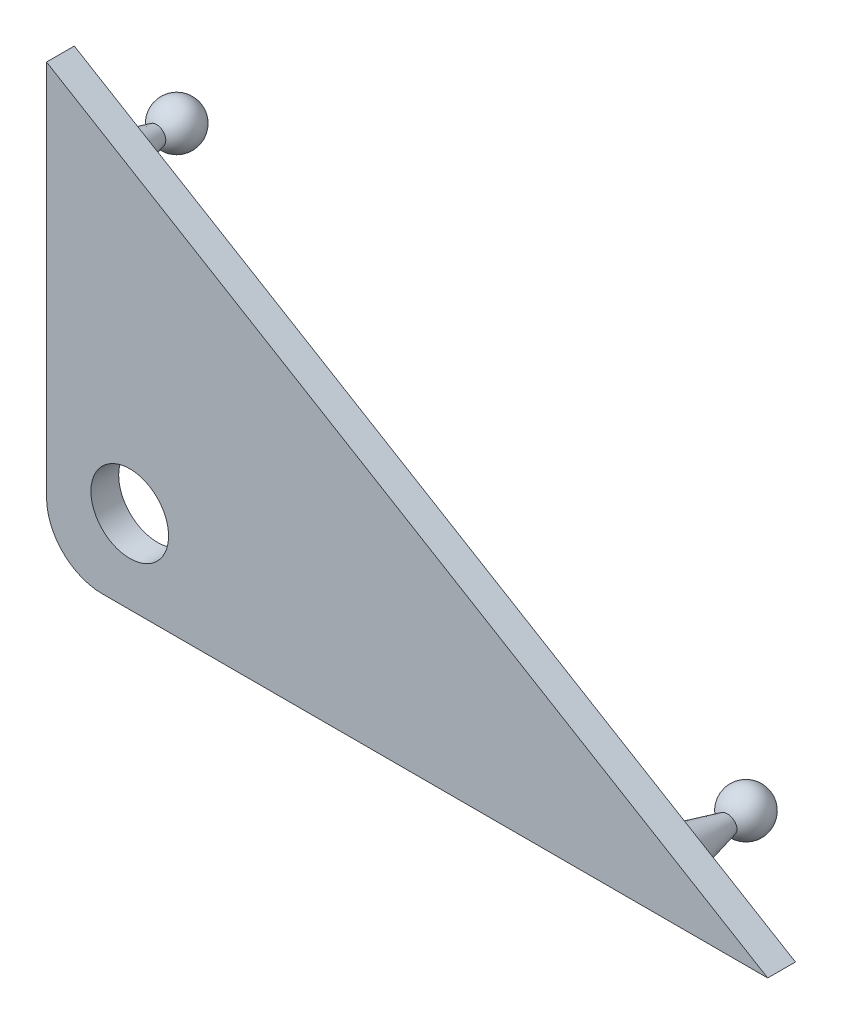
ISO-10303-21;
HEADER;
FILE_DESCRIPTION(('STEP AP214'),'2;1');
FILE_NAME('part.step','',(''),(''),'','','');
FILE_SCHEMA(('AUTOMOTIVE_DESIGN { 1 0 10303 214 1 1 1 1 }'));
ENDSEC;
DATA;
#1=APPLICATION_CONTEXT('core data for automotive mechanical design processes');
#2=APPLICATION_PROTOCOL_DEFINITION('international standard','automotive_design',2000,#1);
#3=PRODUCT_CONTEXT('',#1,'mechanical');
#4=PRODUCT('Part','Part','',(#3));
#5=PRODUCT_RELATED_PRODUCT_CATEGORY('part','',(#4));
#6=PRODUCT_DEFINITION_FORMATION('','',#4);
#7=PRODUCT_DEFINITION_CONTEXT('part definition',#1,'design');
#8=PRODUCT_DEFINITION('design','',#6,#7);
#9=PRODUCT_DEFINITION_SHAPE('','',#8);
#10=(LENGTH_UNIT() NAMED_UNIT(*) SI_UNIT(.MILLI.,.METRE.));
#11=(NAMED_UNIT(*) PLANE_ANGLE_UNIT() SI_UNIT($,.RADIAN.));
#12=(NAMED_UNIT(*) SI_UNIT($,.STERADIAN.) SOLID_ANGLE_UNIT());
#13=UNCERTAINTY_MEASURE_WITH_UNIT(LENGTH_MEASURE(1.E-05),#10,'distance_accuracy_value','');
#14=(GEOMETRIC_REPRESENTATION_CONTEXT(3) GLOBAL_UNCERTAINTY_ASSIGNED_CONTEXT((#13)) GLOBAL_UNIT_ASSIGNED_CONTEXT((#10,
#11,#12)) REPRESENTATION_CONTEXT('',''));
#15=CARTESIAN_POINT('',(0.,0.,0.));
#16=DIRECTION('',(0.,0.,1.));
#17=DIRECTION('',(1.,0.,0.));
#18=AXIS2_PLACEMENT_3D('',#15,#16,#17);
#19=CARTESIAN_POINT('',(0.,0.,0.));
#20=DIRECTION('',(0.,0.,-1.));
#21=DIRECTION('',(-1.,0.,0.));
#22=AXIS2_PLACEMENT_3D('',#19,#20,#21);
#23=PLANE('',#22);
#24=CARTESIAN_POINT('',(5.46398521278585,62.1376068087983,0.));
#25=DIRECTION('',(0.,0.,-1.));
#26=DIRECTION('',(-1.,0.,0.));
#27=AXIS2_PLACEMENT_3D('',#24,#25,#26);
#28=CIRCLE('',#27,4.);
#29=CARTESIAN_POINT('',(1.46398521278585,62.1376068087983,0.));
#30=VERTEX_POINT('',#29);
#31=EDGE_CURVE('E111',#30,#30,#28,.T.);
#32=ORIENTED_EDGE('',*,*,#31,.F.);
#33=EDGE_LOOP('',(#32));
#34=FACE_BOUND('',#33,.T.);
#35=CARTESIAN_POINT('',(15.,15.,0.));
#36=DIRECTION('',(0.,0.,-1.));
#37=DIRECTION('',(-1.,0.,0.));
#38=AXIS2_PLACEMENT_3D('',#35,#36,#37);
#39=CIRCLE('',#38,7.);
#40=CARTESIAN_POINT('',(8.,15.,0.));
#41=VERTEX_POINT('',#40);
#42=EDGE_CURVE('E116',#41,#41,#39,.T.);
#43=ORIENTED_EDGE('',*,*,#42,.F.);
#44=EDGE_LOOP('',(#43));
#45=FACE_BOUND('',#44,.T.);
#46=DIRECTION('',(1.,0.,0.));
#47=VECTOR('',#46,1.);
#48=CARTESIAN_POINT('',(130.,0.,0.));
#49=LINE('',#48,#47);
#50=CARTESIAN_POINT('',(9.99999999999999,0.,0.));
#51=VERTEX_POINT('',#50);
#52=CARTESIAN_POINT('',(130.,0.,0.));
#53=VERTEX_POINT('',#52);
#54=EDGE_CURVE('E100',#51,#53,#49,.T.);
#55=ORIENTED_EDGE('',*,*,#54,.F.);
#56=CARTESIAN_POINT('',(9.99999999999999,10.,0.));
#57=DIRECTION('',(0.,0.,-1.));
#58=DIRECTION('',(-1.,0.,0.));
#59=AXIS2_PLACEMENT_3D('',#56,#57,#58);
#60=CIRCLE('',#59,10.);
#61=CARTESIAN_POINT('',(0.,10.,0.));
#62=VERTEX_POINT('',#61);
#63=EDGE_CURVE('E61',#51,#62,#60,.T.);
#64=ORIENTED_EDGE('',*,*,#63,.T.);
#65=DIRECTION('',(0.,-1.,0.));
#66=VECTOR('',#65,1.);
#67=CARTESIAN_POINT('',(0.,0.,0.));
#68=LINE('',#67,#66);
#69=CARTESIAN_POINT('',(0.,78.,0.));
#70=VERTEX_POINT('',#69);
#71=EDGE_CURVE('E89',#70,#62,#68,.T.);
#72=ORIENTED_EDGE('',*,*,#71,.F.);
#73=DIRECTION('',(-0.857492925712544,0.514495755427526,0.));
#74=VECTOR('',#73,1.);
#75=CARTESIAN_POINT('',(0.,78.,0.));
#76=LINE('',#75,#74);
#77=EDGE_CURVE('E131',#53,#70,#76,.T.);
#78=ORIENTED_EDGE('',*,*,#77,.F.);
#79=EDGE_LOOP('',(#55,#64,#72,#78));
#80=FACE_BOUND('',#79,.T.);
#81=CARTESIAN_POINT('',(108.338096210309,6.,0.));
#82=DIRECTION('',(0.,0.,-1.));
#83=DIRECTION('',(-1.,0.,0.));
#84=AXIS2_PLACEMENT_3D('',#81,#82,#83);
#85=CIRCLE('',#84,4.00000000000001);
#86=CARTESIAN_POINT('',(104.338096210309,6.,0.));
#87=VERTEX_POINT('',#86);
#88=EDGE_CURVE('E112',#87,#87,#85,.T.);
#89=ORIENTED_EDGE('',*,*,#88,.F.);
#90=EDGE_LOOP('',(#89));
#91=FACE_BOUND('',#90,.T.);
#92=ADVANCED_FACE('F33',(#34,#45,#80,#91),#23,.T.);
#93=CARTESIAN_POINT('',(130.,0.,5.));
#94=DIRECTION('',(0.,1.,0.));
#95=DIRECTION('',(-1.,0.,0.));
#96=AXIS2_PLACEMENT_3D('',#93,#94,#95);
#97=PLANE('',#96);
#98=DIRECTION('',(1.,0.,0.));
#99=VECTOR('',#98,1.);
#100=CARTESIAN_POINT('',(130.,0.,5.));
#101=LINE('',#100,#99);
#102=CARTESIAN_POINT('',(9.99999999999999,0.,5.));
#103=VERTEX_POINT('',#102);
#104=CARTESIAN_POINT('',(130.,0.,5.));
#105=VERTEX_POINT('',#104);
#106=EDGE_CURVE('E79',#103,#105,#101,.T.);
#107=ORIENTED_EDGE('',*,*,#106,.F.);
#108=DIRECTION('',(0.,0.,-1.));
#109=VECTOR('',#108,1.);
#110=CARTESIAN_POINT('',(9.99999999999999,0.,5.));
#111=LINE('',#110,#109);
#112=EDGE_CURVE('E102',#103,#51,#111,.T.);
#113=ORIENTED_EDGE('',*,*,#112,.T.);
#114=ORIENTED_EDGE('',*,*,#54,.T.);
#115=DIRECTION('',(0.,0.,-1.));
#116=VECTOR('',#115,1.);
#117=CARTESIAN_POINT('',(130.,0.,5.));
#118=LINE('',#117,#116);
#119=EDGE_CURVE('E94',#105,#53,#118,.T.);
#120=ORIENTED_EDGE('',*,*,#119,.F.);
#121=EDGE_LOOP('',(#107,#113,#114,#120));
#122=FACE_BOUND('',#121,.T.);
#123=ADVANCED_FACE('F99',(#122),#97,.F.);
#124=CARTESIAN_POINT('',(0.,78.,5.));
#125=DIRECTION('',(-0.514495755427526,-0.857492925712544,0.));
#126=DIRECTION('',(0.857492925712544,-0.514495755427526,0.));
#127=AXIS2_PLACEMENT_3D('',#124,#125,#126);
#128=PLANE('',#127);
#129=ORIENTED_EDGE('',*,*,#77,.T.);
#130=DIRECTION('',(0.,0.,-1.));
#131=VECTOR('',#130,1.);
#132=CARTESIAN_POINT('',(0.,78.,5.));
#133=LINE('',#132,#131);
#134=CARTESIAN_POINT('',(0.,78.,5.));
#135=VERTEX_POINT('',#134);
#136=EDGE_CURVE('E96',#135,#70,#133,.T.);
#137=ORIENTED_EDGE('',*,*,#136,.F.);
#138=DIRECTION('',(-0.857492925712544,0.514495755427526,0.));
#139=VECTOR('',#138,1.);
#140=CARTESIAN_POINT('',(0.,78.,5.));
#141=LINE('',#140,#139);
#142=EDGE_CURVE('E82',#105,#135,#141,.T.);
#143=ORIENTED_EDGE('',*,*,#142,.F.);
#144=ORIENTED_EDGE('',*,*,#119,.T.);
#145=EDGE_LOOP('',(#129,#137,#143,#144));
#146=FACE_BOUND('',#145,.T.);
#147=ADVANCED_FACE('F93',(#146),#128,.F.);
#148=CARTESIAN_POINT('',(0.,0.,5.));
#149=DIRECTION('',(1.,0.,0.));
#150=DIRECTION('',(0.,0.,-1.));
#151=AXIS2_PLACEMENT_3D('',#148,#149,#150);
#152=PLANE('',#151);
#153=ORIENTED_EDGE('',*,*,#71,.T.);
#154=DIRECTION('',(0.,0.,-1.));
#155=VECTOR('',#154,1.);
#156=CARTESIAN_POINT('',(0.,10.,5.));
#157=LINE('',#156,#155);
#158=CARTESIAN_POINT('',(0.,10.,5.));
#159=VERTEX_POINT('',#158);
#160=EDGE_CURVE('E46',#62,#159,#157,.F.);
#161=ORIENTED_EDGE('',*,*,#160,.T.);
#162=DIRECTION('',(0.,-1.,0.));
#163=VECTOR('',#162,1.);
#164=CARTESIAN_POINT('',(0.,0.,5.));
#165=LINE('',#164,#163);
#166=EDGE_CURVE('E97',#135,#159,#165,.T.);
#167=ORIENTED_EDGE('',*,*,#166,.F.);
#168=ORIENTED_EDGE('',*,*,#136,.T.);
#169=EDGE_LOOP('',(#153,#161,#167,#168));
#170=FACE_BOUND('',#169,.T.);
#171=ADVANCED_FACE('F132',(#170),#152,.F.);
#172=CARTESIAN_POINT('',(0.,0.,5.));
#173=DIRECTION('',(0.,0.,-1.));
#174=DIRECTION('',(-1.,0.,0.));
#175=AXIS2_PLACEMENT_3D('',#172,#173,#174);
#176=PLANE('',#175);
#177=CARTESIAN_POINT('',(15.,15.,5.));
#178=DIRECTION('',(0.,0.,-1.));
#179=DIRECTION('',(-1.,0.,0.));
#180=AXIS2_PLACEMENT_3D('',#177,#178,#179);
#181=CIRCLE('',#180,7.);
#182=CARTESIAN_POINT('',(8.,15.,5.));
#183=VERTEX_POINT('',#182);
#184=EDGE_CURVE('E124',#183,#183,#181,.T.);
#185=ORIENTED_EDGE('',*,*,#184,.T.);
#186=EDGE_LOOP('',(#185));
#187=FACE_BOUND('',#186,.T.);
#188=ORIENTED_EDGE('',*,*,#166,.T.);
#189=CARTESIAN_POINT('',(9.99999999999999,10.,5.));
#190=DIRECTION('',(0.,0.,-1.));
#191=DIRECTION('',(-1.,0.,0.));
#192=AXIS2_PLACEMENT_3D('',#189,#190,#191);
#193=CIRCLE('',#192,10.);
#194=EDGE_CURVE('E11',#159,#103,#193,.F.);
#195=ORIENTED_EDGE('',*,*,#194,.T.);
#196=ORIENTED_EDGE('',*,*,#106,.T.);
#197=ORIENTED_EDGE('',*,*,#142,.T.);
#198=EDGE_LOOP('',(#188,#195,#196,#197));
#199=FACE_BOUND('',#198,.T.);
#200=ADVANCED_FACE('F81',(#187,#199),#176,.F.);
#201=CARTESIAN_POINT('',(15.,15.,5.));
#202=DIRECTION('',(0.,0.,-1.));
#203=DIRECTION('',(-1.,0.,0.));
#204=AXIS2_PLACEMENT_3D('',#201,#202,#203);
#205=CYLINDRICAL_SURFACE('',#204,7.);
#206=ORIENTED_EDGE('',*,*,#184,.F.);
#207=EDGE_LOOP('',(#206));
#208=FACE_BOUND('',#207,.T.);
#209=ORIENTED_EDGE('',*,*,#42,.T.);
#210=EDGE_LOOP('',(#209));
#211=FACE_BOUND('',#210,.T.);
#212=ADVANCED_FACE('F164',(#208,#211),#205,.F.);
#213=CARTESIAN_POINT('',(9.99999999999999,10.,5.));
#214=DIRECTION('',(0.,0.,-1.));
#215=DIRECTION('',(-1.,0.,0.));
#216=AXIS2_PLACEMENT_3D('',#213,#214,#215);
#217=CYLINDRICAL_SURFACE('',#216,10.);
#218=ORIENTED_EDGE('',*,*,#194,.F.);
#219=ORIENTED_EDGE('',*,*,#160,.F.);
#220=ORIENTED_EDGE('',*,*,#63,.F.);
#221=ORIENTED_EDGE('',*,*,#112,.F.);
#222=EDGE_LOOP('',(#218,#219,#220,#221));
#223=FACE_BOUND('',#222,.T.);
#224=ADVANCED_FACE('F35',(#223),#217,.T.);
#225=CARTESIAN_POINT('',(5.46398521278585,62.1376068087983,0.));
#226=DIRECTION('',(0.,0.,1.));
#227=DIRECTION('',(-1.,0.,0.));
#228=AXIS2_PLACEMENT_3D('',#225,#226,#227);
#229=CONICAL_SURFACE('',#228,4.,0.244346095279206);
#230=CARTESIAN_POINT('',(5.46398521278585,62.1376068087983,-9.36322196273929));
#231=DIRECTION('',(0.,0.,-1.));
#232=DIRECTION('',(-1.,0.,0.));
#233=AXIS2_PLACEMENT_3D('',#230,#231,#232);
#234=CIRCLE('',#233,1.66548656785281);
#235=CARTESIAN_POINT('',(3.79849864493304,62.1376068087983,-9.36322196273929));
#236=VERTEX_POINT('',#235);
#237=EDGE_CURVE('E109',#236,#236,#234,.F.);
#238=ORIENTED_EDGE('',*,*,#237,.T.);
#239=EDGE_LOOP('',(#238));
#240=FACE_BOUND('',#239,.T.);
#241=ORIENTED_EDGE('',*,*,#31,.T.);
#242=EDGE_LOOP('',(#241));
#243=FACE_BOUND('',#242,.T.);
#244=ADVANCED_FACE('F176',(#240,#243),#229,.T.);
#245=CARTESIAN_POINT('',(5.46398521278585,62.1376068087983,-13.));
#246=DIRECTION('',(0.,-1.,0.));
#247=DIRECTION('',(0.,0.,1.));
#248=AXIS2_PLACEMENT_3D('',#245,#246,#247);
#249=SPHERICAL_SURFACE('',#248,4.);
#250=CARTESIAN_POINT('',(5.46398521278585,62.1376068087983,-13.));
#251=DIRECTION('',(0.,0.,-1.));
#252=DIRECTION('',(-1.,0.,0.));
#253=AXIS2_PLACEMENT_3D('',#250,#251,#252);
#254=SPHERICAL_SURFACE('',#253,4.);
#255=ORIENTED_EDGE('',*,*,#237,.F.);
#256=EDGE_LOOP('',(#255));
#257=FACE_BOUND('',#256,.T.);
#258=ADVANCED_FACE('F182',(#257),#254,.T.);
#259=CARTESIAN_POINT('',(108.338096210309,6.,0.));
#260=DIRECTION('',(0.,0.,1.));
#261=DIRECTION('',(-1.,0.,0.));
#262=AXIS2_PLACEMENT_3D('',#259,#260,#261);
#263=CONICAL_SURFACE('',#262,4.00000000000001,0.244346095279206);
#264=CARTESIAN_POINT('',(106.885601437607,6.87149686362169,-9.24932035019595));
#265=CARTESIAN_POINT('',(106.837647611021,6.79156574245964,-9.24932063711287));
#266=CARTESIAN_POINT('',(106.796394270072,6.70753556015525,-9.24989260371648));
#267=CARTESIAN_POINT('',(106.728518661837,6.53369493617217,-9.2521675502343));
#268=CARTESIAN_POINT('',(106.701914048048,6.44387766524838,-9.2538718893632));
#269=CARTESIAN_POINT('',(106.664141237861,6.26112152730028,-9.25836659816437));
#270=CARTESIAN_POINT('',(106.65296488909,6.16818433547258,-9.26115639327642));
#271=CARTESIAN_POINT('',(106.646331916843,5.9818123225981,-9.26774794327339));
#272=CARTESIAN_POINT('',(106.650871474208,5.88837762796052,-9.2715494520921));
#273=CARTESIAN_POINT('',(106.675530072185,5.703495691767,-9.28007052538648));
#274=CARTESIAN_POINT('',(106.695671057907,5.61205143640678,-9.28479137600877));
#275=CARTESIAN_POINT('',(106.75097058211,5.43386566313967,-9.29502256395017));
#276=CARTESIAN_POINT('',(106.786129884576,5.34712438472718,-9.30053294142319));
#277=CARTESIAN_POINT('',(106.87055568699,5.18059062334193,-9.31220968412891));
#278=CARTESIAN_POINT('',(106.919855464179,5.10081511770324,-9.31837757493884));
#279=CARTESIAN_POINT('',(107.031119199807,4.95069127449943,-9.33119157361977));
#280=CARTESIAN_POINT('',(107.093083307281,4.88034304789112,-9.33783768711793));
#281=CARTESIAN_POINT('',(107.228076326487,4.75089817911515,-9.3514423299889));
#282=CARTESIAN_POINT('',(107.301130969524,4.69182844323104,-9.35840155869417));
#283=CARTESIAN_POINT('',(107.456124040637,4.5868144276681,-9.37242392736023));
#284=CARTESIAN_POINT('',(107.538062537106,4.54087024904364,-9.37948706812062));
#285=CARTESIAN_POINT('',(107.708616065957,4.4633570179799,-9.39352662707319));
#286=CARTESIAN_POINT('',(107.797239697693,4.43180686168216,-9.40050291964025));
#287=CARTESIAN_POINT('',(107.978555504092,4.38407292765158,-9.41415791121905));
#288=CARTESIAN_POINT('',(108.071247686599,4.36788917955134,-9.4208366096569));
#289=CARTESIAN_POINT('',(108.258033818573,4.3513646055526,-9.43369750874009));
#290=CARTESIAN_POINT('',(108.352127239667,4.35101795197164,-9.4398798911822));
#291=CARTESIAN_POINT('',(108.539070877407,4.36618170759402,-9.45156545042357));
#292=CARTESIAN_POINT('',(108.631921105549,4.38169197005389,-9.45706863350778));
#293=CARTESIAN_POINT('',(108.813546262185,4.42810217032162,-9.46721754141344));
#294=CARTESIAN_POINT('',(108.902328853893,4.45897175019481,-9.47186493299285));
#295=CARTESIAN_POINT('',(109.073474944906,4.53522641857185,-9.48017147759438));
#296=CARTESIAN_POINT('',(109.155838539458,4.58061129164483,-9.48383064528188));
#297=CARTESIAN_POINT('',(109.311569490047,4.68447352105421,-9.49003703539429));
#298=CARTESIAN_POINT('',(109.38496084515,4.7429147136436,-9.49258727295357));
#299=CARTESIAN_POINT('',(109.520908290526,4.8713058917052,-9.49650951443642));
#300=CARTESIAN_POINT('',(109.583464534167,4.94125571424912,-9.49788153503838));
#301=CARTESIAN_POINT('',(109.695824197035,5.090505299084,-9.49940184371932));
#302=CARTESIAN_POINT('',(109.745655889742,5.16978375023232,-9.49955286812837));
#303=CARTESIAN_POINT('',(109.831332031441,5.33556211264128,-9.498633576818));
#304=CARTESIAN_POINT('',(109.867176569978,5.42206197766655,-9.49756326891766));
#305=CARTESIAN_POINT('',(109.923846985545,5.59976238966552,-9.49423653213323));
#306=CARTESIAN_POINT('',(109.94468293226,5.69095974086501,-9.49198090027668));
#307=CARTESIAN_POINT('',(109.970798299617,5.87552107990389,-9.4863552629878));
#308=CARTESIAN_POINT('',(109.976077657451,5.96888507648929,-9.48298525305636));
#309=CARTESIAN_POINT('',(109.97094563811,6.15525219057526,-9.47523139699025));
#310=CARTESIAN_POINT('',(109.960515083448,6.24825472783052,-9.47084631726674));
#311=CARTESIAN_POINT('',(109.924244263902,6.43115728802437,-9.46119992546383));
#312=CARTESIAN_POINT('',(109.898403799458,6.52105727076892,-9.45593860203771));
#313=CARTESIAN_POINT('',(109.831978232306,6.69544572925003,-9.44468511764867));
#314=CARTESIAN_POINT('',(109.791356147125,6.77992000106802,-9.43869114886465));
#315=CARTESIAN_POINT('',(109.69654237906,6.94083049475008,-9.42616221812869));
#316=CARTESIAN_POINT('',(109.642350508024,7.01726660513972,-9.41962724867632));
#317=CARTESIAN_POINT('',(109.521778496205,7.16014169921501,-9.40619032752245));
#318=CARTESIAN_POINT('',(109.45536671527,7.22655389683992,-9.39928745698157));
#319=CARTESIAN_POINT('',(109.31233555994,7.3472665745601,-9.38533018796718));
#320=CARTESIAN_POINT('',(109.235716058447,7.40156690382738,-9.37827578760788));
#321=CARTESIAN_POINT('',(109.074312031103,7.4965948917942,-9.36420492032054));
#322=CARTESIAN_POINT('',(108.989514994512,7.5373013147407,-9.35718852943213));
#323=CARTESIAN_POINT('',(108.814260796556,7.60386452820347,-9.34340152791131));
#324=CARTESIAN_POINT('',(108.723803613995,7.6297212631046,-9.33663091819949));
#325=CARTESIAN_POINT('',(108.539807981603,7.66583655884516,-9.32352354413598));
#326=CARTESIAN_POINT('',(108.44626992055,7.67609708012466,-9.31718672535253));
#327=CARTESIAN_POINT('',(108.258766017279,7.68071659009699,-9.30511947272867));
#328=CARTESIAN_POINT('',(108.164800195138,7.67507631758139,-9.29938901072821));
#329=CARTESIAN_POINT('',(107.979287475995,7.64806180101486,-9.28869908155628));
#330=CARTESIAN_POINT('',(107.887736511368,7.62671603279526,-9.28373823866425));
#331=CARTESIAN_POINT('',(107.709466939064,7.56890078832152,-9.27470695579453));
#332=CARTESIAN_POINT('',(107.622749476747,7.53242774460179,-9.2706367261963));
#333=CARTESIAN_POINT('',(107.456831465584,7.44547924370583,-9.26350410109949));
#334=CARTESIAN_POINT('',(107.377616209921,7.39503197643743,-9.26043970346722));
#335=CARTESIAN_POINT('',(107.228838022623,7.2815616078144,-9.25539146746531));
#336=CARTESIAN_POINT('',(107.159263431754,7.21855392581257,-9.25340631522657));
#337=CARTESIAN_POINT('',(107.055758216701,7.10759137748827,-9.2510996828717));
#338=CARTESIAN_POINT('',(107.018271439435,7.06290340246516,-9.25043321544161));
#339=CARTESIAN_POINT('',(106.948183857698,6.96984334006302,-9.24954345978747));
#340=CARTESIAN_POINT('',(106.915583044923,6.92147125894503,-9.24932017081026));
#341=CARTESIAN_POINT('',(106.885601437607,6.87149686362169,-9.24932035019595));
#342=B_SPLINE_CURVE_WITH_KNOTS('',3,(#264,#265,#266,#267,#268,#269,#270,#271,#272,#273,#274,
#275,#276,#277,#278,#279,#280,#281,#282,#283,#284,#285,#286,#287,#288,#289,#290,#291,#292,#293,
#294,#295,#296,#297,#298,#299,#300,#301,#302,#303,#304,#305,#306,#307,#308,#309,#310,#311,#312,
#313,#314,#315,#316,#317,#318,#319,#320,#321,#322,#323,#324,#325,#326,#327,#328,#329,#330,#331,
#332,#333,#334,#335,#336,#337,#338,#339,#340,#341),.UNSPECIFIED.,.T.,.F.,(4,2,2,2,2,2,2,2,2,2,2,
2,2,2,2,2,2,2,2,2,2,2,2,2,2,2,2,2,2,2,2,2,2,2,2,2,2,2,4),(0.,0.279424343371801,
0.559184694083422,0.838797161356376,1.11834168411296,1.39828013232525,1.67823282276014,
1.95884981777252,2.23947011528915,2.52075172541667,2.8020355010878,3.08368748453456,
3.36534001111827,3.6468888952877,3.92843517396408,4.20942716944852,4.49041499474247,
4.77063397467743,5.05084898787878,5.33043584686784,5.6100209159292,5.88941822838493,
6.16881666886883,6.44855645460973,6.72829986305983,7.00874803505259,7.28920009582971,
7.57038879934949,7.85158100429093,8.1332104416404,8.41484093374329,8.69643602203689,
8.97801802691793,9.25909074612565,9.54022978844096,9.82080577396334,10.1010394181292,
10.2757409126995,10.450442110376),.UNSPECIFIED.);
#343=CARTESIAN_POINT('',(106.885601437607,6.87149686362169,-9.24932035019595));
#344=VERTEX_POINT('',#343);
#345=EDGE_CURVE('E37',#344,#344,#342,.T.);
#346=ORIENTED_EDGE('',*,*,#345,.T.);
#347=EDGE_LOOP('',(#346));
#348=FACE_BOUND('',#347,.T.);
#349=ORIENTED_EDGE('',*,*,#88,.T.);
#350=EDGE_LOOP('',(#349));
#351=FACE_BOUND('',#350,.T.);
#352=ADVANCED_FACE('F189',(#348,#351),#263,.T.);
#353=CARTESIAN_POINT('',(108.077609803567,6.15629184404559,-13.));
#354=DIRECTION('',(-0.857492925712544,0.514495755427526,0.));
#355=DIRECTION('',(0.,0.,-1.));
#356=AXIS2_PLACEMENT_3D('',#353,#354,#355);
#357=SPHERICAL_SURFACE('',#356,4.00000000000001);
#358=ORIENTED_EDGE('',*,*,#345,.F.);
#359=EDGE_LOOP('',(#358));
#360=FACE_BOUND('',#359,.T.);
#361=ADVANCED_FACE('F197',(#360),#357,.T.);
#362=CLOSED_SHELL('',(#92,#123,#147,#171,#200,#212,#224,#244,#258,#352,#361));
#363=MANIFOLD_SOLID_BREP('B2',#362);
#364=ADVANCED_BREP_SHAPE_REPRESENTATION('',(#18,#363),#14);
#365=SHAPE_DEFINITION_REPRESENTATION(#9,#364);
ENDSEC;
END-ISO-10303-21;
